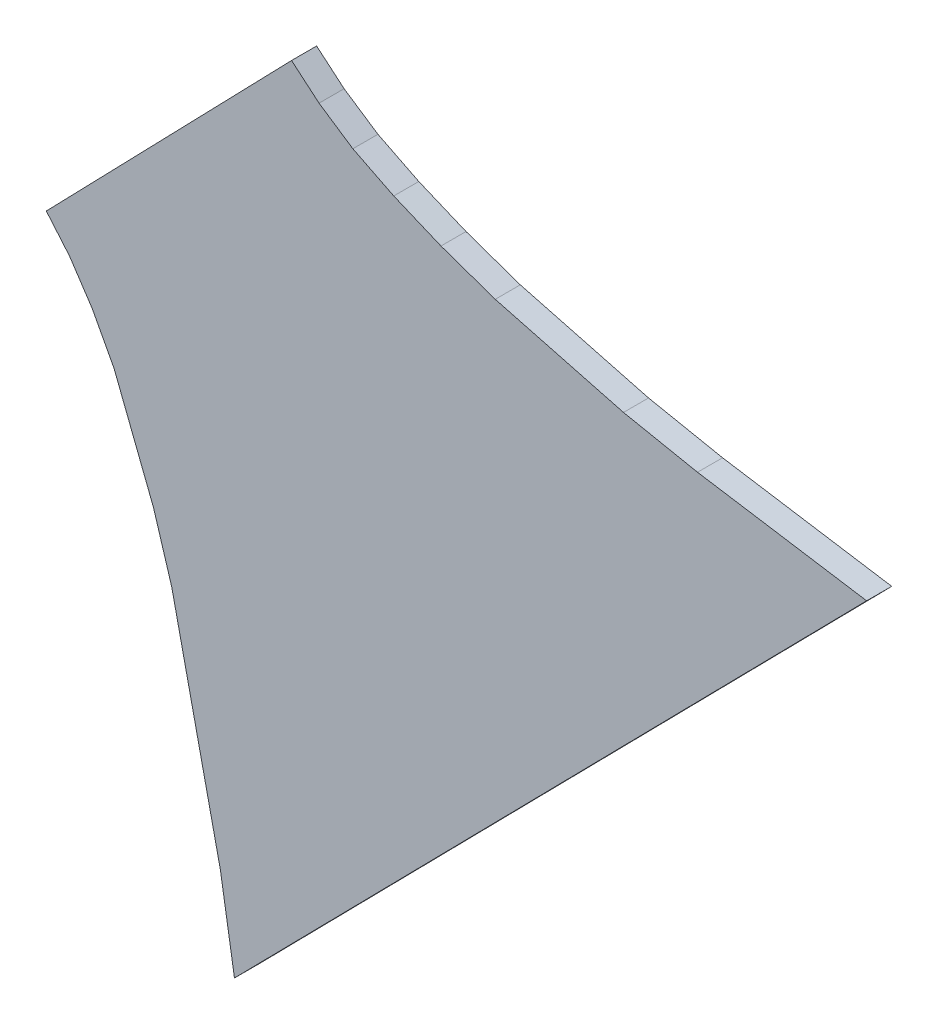
ISO-10303-21;
HEADER;
FILE_DESCRIPTION(('STEP AP214'),'2;1');
FILE_NAME('part.step','',(''),(''),'','','');
FILE_SCHEMA(('AUTOMOTIVE_DESIGN { 1 0 10303 214 1 1 1 1 }'));
ENDSEC;
DATA;
#1=APPLICATION_CONTEXT('core data for automotive mechanical design processes');
#2=APPLICATION_PROTOCOL_DEFINITION('international standard','automotive_design',2000,#1);
#3=PRODUCT_CONTEXT('',#1,'mechanical');
#4=PRODUCT('Part','Part','',(#3));
#5=PRODUCT_RELATED_PRODUCT_CATEGORY('part','',(#4));
#6=PRODUCT_DEFINITION_FORMATION('','',#4);
#7=PRODUCT_DEFINITION_CONTEXT('part definition',#1,'design');
#8=PRODUCT_DEFINITION('design','',#6,#7);
#9=PRODUCT_DEFINITION_SHAPE('','',#8);
#10=(LENGTH_UNIT() NAMED_UNIT(*) SI_UNIT(.MILLI.,.METRE.));
#11=(NAMED_UNIT(*) PLANE_ANGLE_UNIT() SI_UNIT($,.RADIAN.));
#12=(NAMED_UNIT(*) SI_UNIT($,.STERADIAN.) SOLID_ANGLE_UNIT());
#13=UNCERTAINTY_MEASURE_WITH_UNIT(LENGTH_MEASURE(1.E-05),#10,'distance_accuracy_value','');
#14=(GEOMETRIC_REPRESENTATION_CONTEXT(3) GLOBAL_UNCERTAINTY_ASSIGNED_CONTEXT((#13)) GLOBAL_UNIT_ASSIGNED_CONTEXT((#10,
#11,#12)) REPRESENTATION_CONTEXT('',''));
#15=CARTESIAN_POINT('',(0.,0.,0.));
#16=DIRECTION('',(0.,0.,1.));
#17=DIRECTION('',(1.,0.,0.));
#18=AXIS2_PLACEMENT_3D('',#15,#16,#17);
#19=CARTESIAN_POINT('',(96.3420028686523,104.190002441406,0.));
#20=DIRECTION('',(0.763425936268127,0.645895378395862,0.));
#21=DIRECTION('',(0.645895378395862,-0.763425936268127,0.));
#22=AXIS2_PLACEMENT_3D('',#19,#20,#21);
#23=PLANE('',#22);
#24=DIRECTION('',(0.645895378395862,-0.763425936268127,0.));
#25=VECTOR('',#24,1.);
#26=CARTESIAN_POINT('',(96.3420028686523,104.190002441406,0.03556));
#27=LINE('',#26,#25);
#28=CARTESIAN_POINT('',(96.3420028686523,104.190002441406,0.03556));
#29=VERTEX_POINT('',#28);
#30=CARTESIAN_POINT('',(96.375,104.151000976562,0.03556));
#31=VERTEX_POINT('',#30);
#32=EDGE_CURVE('E11',#29,#31,#27,.T.);
#33=ORIENTED_EDGE('',*,*,#32,.F.);
#34=DIRECTION('',(0.,0.,1.));
#35=VECTOR('',#34,1.);
#36=CARTESIAN_POINT('',(96.3420028686523,104.190002441406,0.));
#37=LINE('',#36,#35);
#38=CARTESIAN_POINT('',(96.3420028686523,104.190002441406,0.));
#39=VERTEX_POINT('',#38);
#40=EDGE_CURVE('E24',#39,#29,#37,.T.);
#41=ORIENTED_EDGE('',*,*,#40,.F.);
#42=DIRECTION('',(0.645895378395862,-0.763425936268127,0.));
#43=VECTOR('',#42,1.);
#44=CARTESIAN_POINT('',(96.3420028686523,104.190002441406,0.));
#45=LINE('',#44,#43);
#46=CARTESIAN_POINT('',(96.375,104.151000976562,0.));
#47=VERTEX_POINT('',#46);
#48=EDGE_CURVE('E154',#39,#47,#45,.T.);
#49=ORIENTED_EDGE('',*,*,#48,.T.);
#50=DIRECTION('',(0.,0.,1.));
#51=VECTOR('',#50,1.);
#52=CARTESIAN_POINT('',(96.375,104.151000976562,0.));
#53=LINE('',#52,#51);
#54=EDGE_CURVE('E37',#47,#31,#53,.T.);
#55=ORIENTED_EDGE('',*,*,#54,.T.);
#56=EDGE_LOOP('',(#33,#41,#49,#55));
#57=FACE_BOUND('',#56,.T.);
#58=ADVANCED_FACE('F17',(#57),#23,.F.);
#59=CARTESIAN_POINT('',(96.375,104.151000976562,0.));
#60=DIRECTION('',(0.832090983134532,0.554639158179629,0.));
#61=DIRECTION('',(0.554639158179629,-0.832090983134532,0.));
#62=AXIS2_PLACEMENT_3D('',#59,#60,#61);
#63=PLANE('',#62);
#64=DIRECTION('',(0.554639158179629,-0.832090983134532,0.));
#65=VECTOR('',#64,1.);
#66=CARTESIAN_POINT('',(96.375,104.151000976562,0.03556));
#67=LINE('',#66,#65);
#68=CARTESIAN_POINT('',(96.4069976806641,104.102996826172,0.03556));
#69=VERTEX_POINT('',#68);
#70=EDGE_CURVE('E266',#31,#69,#67,.T.);
#71=ORIENTED_EDGE('',*,*,#70,.F.);
#72=ORIENTED_EDGE('',*,*,#54,.F.);
#73=DIRECTION('',(0.554639158179629,-0.832090983134532,0.));
#74=VECTOR('',#73,1.);
#75=CARTESIAN_POINT('',(96.375,104.151000976562,0.));
#76=LINE('',#75,#74);
#77=CARTESIAN_POINT('',(96.4069976806641,104.102996826172,0.));
#78=VERTEX_POINT('',#77);
#79=EDGE_CURVE('E263',#47,#78,#76,.T.);
#80=ORIENTED_EDGE('',*,*,#79,.T.);
#81=DIRECTION('',(0.,0.,1.));
#82=VECTOR('',#81,1.);
#83=CARTESIAN_POINT('',(96.4069976806641,104.102996826172,0.));
#84=LINE('',#83,#82);
#85=EDGE_CURVE('E261',#78,#69,#84,.T.);
#86=ORIENTED_EDGE('',*,*,#85,.T.);
#87=EDGE_LOOP('',(#71,#72,#80,#86));
#88=FACE_BOUND('',#87,.T.);
#89=ADVANCED_FACE('F274',(#88),#63,.F.);
#90=CARTESIAN_POINT('',(96.4069976806641,104.102996826172,0.));
#91=DIRECTION('',(0.881890090249672,0.471455054824344,0.));
#92=DIRECTION('',(0.471455054824344,-0.881890090249672,0.));
#93=AXIS2_PLACEMENT_3D('',#90,#91,#92);
#94=PLANE('',#93);
#95=DIRECTION('',(0.471455054824344,-0.881890090249672,0.));
#96=VECTOR('',#95,1.);
#97=CARTESIAN_POINT('',(96.4069976806641,104.102996826172,0.03556));
#98=LINE('',#97,#96);
#99=CARTESIAN_POINT('',(96.438003540039,104.044998168945,0.03556));
#100=VERTEX_POINT('',#99);
#101=EDGE_CURVE('E258',#69,#100,#98,.T.);
#102=ORIENTED_EDGE('',*,*,#101,.F.);
#103=ORIENTED_EDGE('',*,*,#85,.F.);
#104=DIRECTION('',(0.471455054824344,-0.881890090249672,0.));
#105=VECTOR('',#104,1.);
#106=CARTESIAN_POINT('',(96.4069976806641,104.102996826172,0.));
#107=LINE('',#106,#105);
#108=CARTESIAN_POINT('',(96.438003540039,104.044998168945,0.));
#109=VERTEX_POINT('',#108);
#110=EDGE_CURVE('E255',#78,#109,#107,.T.);
#111=ORIENTED_EDGE('',*,*,#110,.T.);
#112=DIRECTION('',(0.,0.,1.));
#113=VECTOR('',#112,1.);
#114=CARTESIAN_POINT('',(96.438003540039,104.044998168945,0.));
#115=LINE('',#114,#113);
#116=EDGE_CURVE('E253',#109,#100,#115,.T.);
#117=ORIENTED_EDGE('',*,*,#116,.T.);
#118=EDGE_LOOP('',(#102,#103,#111,#117));
#119=FACE_BOUND('',#118,.T.);
#120=ADVANCED_FACE('F280',(#119),#94,.F.);
#121=CARTESIAN_POINT('',(96.438003540039,104.044998168945,0.));
#122=DIRECTION('',(0.931145260292367,0.36464846665667,0.));
#123=DIRECTION('',(0.36464846665667,-0.931145260292367,0.));
#124=AXIS2_PLACEMENT_3D('',#121,#122,#123);
#125=PLANE('',#124);
#126=DIRECTION('',(0.36464846665667,-0.931145260292367,0.));
#127=VECTOR('',#126,1.);
#128=CARTESIAN_POINT('',(96.438003540039,104.044998168945,0.03556));
#129=LINE('',#128,#127);
#130=CARTESIAN_POINT('',(96.4940032958984,103.902000427246,0.03556));
#131=VERTEX_POINT('',#130);
#132=EDGE_CURVE('E250',#100,#131,#129,.T.);
#133=ORIENTED_EDGE('',*,*,#132,.F.);
#134=ORIENTED_EDGE('',*,*,#116,.F.);
#135=DIRECTION('',(0.36464846665667,-0.931145260292367,0.));
#136=VECTOR('',#135,1.);
#137=CARTESIAN_POINT('',(96.438003540039,104.044998168945,0.));
#138=LINE('',#137,#136);
#139=CARTESIAN_POINT('',(96.4940032958984,103.902000427246,0.));
#140=VERTEX_POINT('',#139);
#141=EDGE_CURVE('E247',#109,#140,#138,.T.);
#142=ORIENTED_EDGE('',*,*,#141,.T.);
#143=DIRECTION('',(0.,0.,1.));
#144=VECTOR('',#143,1.);
#145=CARTESIAN_POINT('',(96.4940032958984,103.902000427246,0.));
#146=LINE('',#145,#144);
#147=EDGE_CURVE('E245',#140,#131,#146,.T.);
#148=ORIENTED_EDGE('',*,*,#147,.T.);
#149=EDGE_LOOP('',(#133,#134,#142,#148));
#150=FACE_BOUND('',#149,.T.);
#151=ADVANCED_FACE('F282',(#150),#125,.F.);
#152=CARTESIAN_POINT('',(96.4940032958984,103.902000427246,0.));
#153=DIRECTION('',(0.956284246933247,0.292438778323451,0.));
#154=DIRECTION('',(0.292438778323451,-0.956284246933247,0.));
#155=AXIS2_PLACEMENT_3D('',#152,#153,#154);
#156=PLANE('',#155);
#157=DIRECTION('',(0.292438778323451,-0.956284246933247,0.));
#158=VECTOR('',#157,1.);
#159=CARTESIAN_POINT('',(96.4940032958984,103.902000427246,0.03556));
#160=LINE('',#159,#158);
#161=CARTESIAN_POINT('',(96.5199966430664,103.817001342773,0.03556));
#162=VERTEX_POINT('',#161);
#163=EDGE_CURVE('E242',#131,#162,#160,.T.);
#164=ORIENTED_EDGE('',*,*,#163,.F.);
#165=ORIENTED_EDGE('',*,*,#147,.F.);
#166=DIRECTION('',(0.292438778323451,-0.956284246933247,0.));
#167=VECTOR('',#166,1.);
#168=CARTESIAN_POINT('',(96.4940032958984,103.902000427246,0.));
#169=LINE('',#168,#167);
#170=CARTESIAN_POINT('',(96.5199966430664,103.817001342773,0.));
#171=VERTEX_POINT('',#170);
#172=EDGE_CURVE('E239',#140,#171,#169,.T.);
#173=ORIENTED_EDGE('',*,*,#172,.T.);
#174=DIRECTION('',(0.,0.,1.));
#175=VECTOR('',#174,1.);
#176=CARTESIAN_POINT('',(96.5199966430664,103.817001342773,0.));
#177=LINE('',#176,#175);
#178=EDGE_CURVE('E237',#171,#162,#177,.T.);
#179=ORIENTED_EDGE('',*,*,#178,.T.);
#180=EDGE_LOOP('',(#164,#165,#173,#179));
#181=FACE_BOUND('',#180,.T.);
#182=ADVANCED_FACE('F287',(#181),#156,.F.);
#183=CARTESIAN_POINT('',(96.5199966430664,103.817001342773,0.));
#184=DIRECTION('',(0.976553070580183,0.21527679935473,0.));
#185=DIRECTION('',(0.21527679935473,-0.976553070580183,0.));
#186=AXIS2_PLACEMENT_3D('',#183,#184,#185);
#187=PLANE('',#186);
#188=DIRECTION('',(0.21527679935473,-0.976553070580183,0.));
#189=VECTOR('',#188,1.);
#190=CARTESIAN_POINT('',(96.5199966430664,103.817001342773,0.03556));
#191=LINE('',#190,#189);
#192=CARTESIAN_POINT('',(96.588996887207,103.503997802734,0.03556));
#193=VERTEX_POINT('',#192);
#194=EDGE_CURVE('E234',#162,#193,#191,.T.);
#195=ORIENTED_EDGE('',*,*,#194,.F.);
#196=ORIENTED_EDGE('',*,*,#178,.F.);
#197=DIRECTION('',(0.21527679935473,-0.976553070580183,0.));
#198=VECTOR('',#197,1.);
#199=CARTESIAN_POINT('',(96.5199966430664,103.817001342773,0.));
#200=LINE('',#199,#198);
#201=CARTESIAN_POINT('',(96.588996887207,103.503997802734,0.));
#202=VERTEX_POINT('',#201);
#203=EDGE_CURVE('E231',#171,#202,#200,.T.);
#204=ORIENTED_EDGE('',*,*,#203,.T.);
#205=DIRECTION('',(0.,0.,1.));
#206=VECTOR('',#205,1.);
#207=CARTESIAN_POINT('',(96.588996887207,103.503997802734,0.));
#208=LINE('',#207,#206);
#209=EDGE_CURVE('E229',#202,#193,#208,.T.);
#210=ORIENTED_EDGE('',*,*,#209,.T.);
#211=EDGE_LOOP('',(#195,#196,#204,#210));
#212=FACE_BOUND('',#211,.T.);
#213=ADVANCED_FACE('F290',(#212),#187,.F.);
#214=CARTESIAN_POINT('',(96.588996887207,103.503997802734,0.));
#215=DIRECTION('',(0.987031644404503,0.160525801490424,0.));
#216=DIRECTION('',(0.160525801490424,-0.987031644404503,0.));
#217=AXIS2_PLACEMENT_3D('',#214,#215,#216);
#218=PLANE('',#217);
#219=DIRECTION('',(0.160525801490424,-0.987031644404503,0.));
#220=VECTOR('',#219,1.);
#221=CARTESIAN_POINT('',(96.588996887207,103.503997802734,0.03556));
#222=LINE('',#221,#220);
#223=CARTESIAN_POINT('',(96.609001159668,103.380996704102,0.03556));
#224=VERTEX_POINT('',#223);
#225=EDGE_CURVE('E226',#193,#224,#222,.T.);
#226=ORIENTED_EDGE('',*,*,#225,.F.);
#227=ORIENTED_EDGE('',*,*,#209,.F.);
#228=DIRECTION('',(0.160525801490424,-0.987031644404503,0.));
#229=VECTOR('',#228,1.);
#230=CARTESIAN_POINT('',(96.588996887207,103.503997802734,0.));
#231=LINE('',#230,#229);
#232=CARTESIAN_POINT('',(96.609001159668,103.380996704102,0.));
#233=VERTEX_POINT('',#232);
#234=EDGE_CURVE('E223',#202,#233,#231,.T.);
#235=ORIENTED_EDGE('',*,*,#234,.T.);
#236=DIRECTION('',(0.,0.,1.));
#237=VECTOR('',#236,1.);
#238=CARTESIAN_POINT('',(96.609001159668,103.380996704102,0.));
#239=LINE('',#238,#237);
#240=EDGE_CURVE('E221',#233,#224,#239,.T.);
#241=ORIENTED_EDGE('',*,*,#240,.T.);
#242=EDGE_LOOP('',(#226,#227,#235,#241));
#243=FACE_BOUND('',#242,.T.);
#244=ADVANCED_FACE('F295',(#243),#218,.F.);
#245=CARTESIAN_POINT('',(96.609001159668,103.380996704102,0.));
#246=DIRECTION('',(-0.712948239240305,0.70121666278273,0.));
#247=DIRECTION('',(0.70121666278273,0.712948239240305,0.));
#248=AXIS2_PLACEMENT_3D('',#245,#246,#247);
#249=PLANE('',#248);
#250=DIRECTION('',(0.70121666278273,0.712948239240305,0.));
#251=VECTOR('',#250,1.);
#252=CARTESIAN_POINT('',(96.609001159668,103.380996704102,0.03556));
#253=LINE('',#252,#251);
#254=CARTESIAN_POINT('',(97.5059967041016,104.292999267578,0.03556));
#255=VERTEX_POINT('',#254);
#256=EDGE_CURVE('E218',#224,#255,#253,.T.);
#257=ORIENTED_EDGE('',*,*,#256,.F.);
#258=ORIENTED_EDGE('',*,*,#240,.F.);
#259=DIRECTION('',(0.70121666278273,0.712948239240305,0.));
#260=VECTOR('',#259,1.);
#261=CARTESIAN_POINT('',(96.609001159668,103.380996704102,0.));
#262=LINE('',#261,#260);
#263=CARTESIAN_POINT('',(97.5059967041016,104.292999267578,0.));
#264=VERTEX_POINT('',#263);
#265=EDGE_CURVE('E215',#233,#264,#262,.T.);
#266=ORIENTED_EDGE('',*,*,#265,.T.);
#267=DIRECTION('',(0.,0.,1.));
#268=VECTOR('',#267,1.);
#269=CARTESIAN_POINT('',(97.5059967041016,104.292999267578,0.));
#270=LINE('',#269,#268);
#271=EDGE_CURVE('E213',#264,#255,#270,.T.);
#272=ORIENTED_EDGE('',*,*,#271,.T.);
#273=EDGE_LOOP('',(#257,#258,#266,#272));
#274=FACE_BOUND('',#273,.T.);
#275=ADVANCED_FACE('F298',(#274),#249,.F.);
#276=CARTESIAN_POINT('',(97.5059967041016,104.292999267578,0.));
#277=DIRECTION('',(-0.156394666310873,-0.987694643272662,0.));
#278=DIRECTION('',(-0.987694643272662,0.156394666310873,0.));
#279=AXIS2_PLACEMENT_3D('',#276,#277,#278);
#280=PLANE('',#279);
#281=DIRECTION('',(-0.987694643272662,0.156394666310873,0.));
#282=VECTOR('',#281,1.);
#283=CARTESIAN_POINT('',(97.5059967041016,104.292999267578,0.03556));
#284=LINE('',#283,#282);
#285=CARTESIAN_POINT('',(97.265998840332,104.331001281738,0.03556));
#286=VERTEX_POINT('',#285);
#287=EDGE_CURVE('E210',#255,#286,#284,.T.);
#288=ORIENTED_EDGE('',*,*,#287,.F.);
#289=ORIENTED_EDGE('',*,*,#271,.F.);
#290=DIRECTION('',(-0.987694643272662,0.156394666310873,0.));
#291=VECTOR('',#290,1.);
#292=CARTESIAN_POINT('',(97.5059967041016,104.292999267578,0.));
#293=LINE('',#292,#291);
#294=CARTESIAN_POINT('',(97.265998840332,104.331001281738,0.));
#295=VERTEX_POINT('',#294);
#296=EDGE_CURVE('E207',#264,#295,#293,.T.);
#297=ORIENTED_EDGE('',*,*,#296,.T.);
#298=DIRECTION('',(0.,0.,1.));
#299=VECTOR('',#298,1.);
#300=CARTESIAN_POINT('',(97.265998840332,104.331001281738,0.));
#301=LINE('',#300,#299);
#302=EDGE_CURVE('E205',#295,#286,#301,.T.);
#303=ORIENTED_EDGE('',*,*,#302,.T.);
#304=EDGE_LOOP('',(#288,#289,#297,#303));
#305=FACE_BOUND('',#304,.T.);
#306=ADVANCED_FACE('F303',(#305),#280,.F.);
#307=CARTESIAN_POINT('',(97.265998840332,104.331001281738,0.));
#308=DIRECTION('',(-0.196088729995348,-0.980586156321214,0.));
#309=DIRECTION('',(-0.980586156321214,0.196088729995348,0.));
#310=AXIS2_PLACEMENT_3D('',#307,#308,#309);
#311=PLANE('',#310);
#312=DIRECTION('',(-0.980586156321213,0.196088729995348,0.));
#313=VECTOR('',#312,1.);
#314=CARTESIAN_POINT('',(97.265998840332,104.331001281738,0.03556));
#315=LINE('',#314,#313);
#316=CARTESIAN_POINT('',(97.161003112793,104.351997375488,0.03556));
#317=VERTEX_POINT('',#316);
#318=EDGE_CURVE('E202',#286,#317,#315,.T.);
#319=ORIENTED_EDGE('',*,*,#318,.F.);
#320=ORIENTED_EDGE('',*,*,#302,.F.);
#321=DIRECTION('',(-0.980586156321213,0.196088729995348,0.));
#322=VECTOR('',#321,1.);
#323=CARTESIAN_POINT('',(97.265998840332,104.331001281738,0.));
#324=LINE('',#323,#322);
#325=CARTESIAN_POINT('',(97.161003112793,104.351997375488,0.));
#326=VERTEX_POINT('',#325);
#327=EDGE_CURVE('E199',#295,#326,#324,.T.);
#328=ORIENTED_EDGE('',*,*,#327,.T.);
#329=DIRECTION('',(0.,0.,1.));
#330=VECTOR('',#329,1.);
#331=CARTESIAN_POINT('',(97.161003112793,104.351997375488,0.));
#332=LINE('',#331,#330);
#333=EDGE_CURVE('E197',#326,#317,#332,.T.);
#334=ORIENTED_EDGE('',*,*,#333,.T.);
#335=EDGE_LOOP('',(#319,#320,#328,#334));
#336=FACE_BOUND('',#335,.T.);
#337=ADVANCED_FACE('F306',(#336),#311,.F.);
#338=CARTESIAN_POINT('',(97.161003112793,104.351997375488,0.));
#339=DIRECTION('',(-0.255027948031509,-0.966933682174139,0.));
#340=DIRECTION('',(-0.966933682174139,0.255027948031509,0.));
#341=AXIS2_PLACEMENT_3D('',#338,#339,#340);
#342=PLANE('',#341);
#343=DIRECTION('',(-0.966933682174139,0.255027948031509,0.));
#344=VECTOR('',#343,1.);
#345=CARTESIAN_POINT('',(97.161003112793,104.351997375488,0.03556));
#346=LINE('',#345,#344);
#347=CARTESIAN_POINT('',(96.9789962768555,104.400001525879,0.03556));
#348=VERTEX_POINT('',#347);
#349=EDGE_CURVE('E194',#317,#348,#346,.T.);
#350=ORIENTED_EDGE('',*,*,#349,.F.);
#351=ORIENTED_EDGE('',*,*,#333,.F.);
#352=DIRECTION('',(-0.966933682174139,0.255027948031509,0.));
#353=VECTOR('',#352,1.);
#354=CARTESIAN_POINT('',(97.161003112793,104.351997375488,0.));
#355=LINE('',#354,#353);
#356=CARTESIAN_POINT('',(96.9789962768555,104.400001525879,0.));
#357=VERTEX_POINT('',#356);
#358=EDGE_CURVE('E191',#326,#357,#355,.T.);
#359=ORIENTED_EDGE('',*,*,#358,.T.);
#360=DIRECTION('',(0.,0.,1.));
#361=VECTOR('',#360,1.);
#362=CARTESIAN_POINT('',(96.9789962768555,104.400001525879,0.));
#363=LINE('',#362,#361);
#364=EDGE_CURVE('E189',#357,#348,#363,.T.);
#365=ORIENTED_EDGE('',*,*,#364,.T.);
#366=EDGE_LOOP('',(#350,#351,#359,#365));
#367=FACE_BOUND('',#366,.T.);
#368=ADVANCED_FACE('F311',(#367),#342,.F.);
#369=CARTESIAN_POINT('',(96.9789962768555,104.400001525879,0.));
#370=DIRECTION('',(-0.33091681426385,-0.94365992923164,0.));
#371=DIRECTION('',(-0.94365992923164,0.33091681426385,0.));
#372=AXIS2_PLACEMENT_3D('',#369,#370,#371);
#373=PLANE('',#372);
#374=DIRECTION('',(-0.94365992923164,0.33091681426385,0.));
#375=VECTOR('',#374,1.);
#376=CARTESIAN_POINT('',(96.9789962768555,104.400001525879,0.03556));
#377=LINE('',#376,#375);
#378=CARTESIAN_POINT('',(96.9020004272461,104.427001953125,0.03556));
#379=VERTEX_POINT('',#378);
#380=EDGE_CURVE('E186',#348,#379,#377,.T.);
#381=ORIENTED_EDGE('',*,*,#380,.F.);
#382=ORIENTED_EDGE('',*,*,#364,.F.);
#383=DIRECTION('',(-0.94365992923164,0.33091681426385,0.));
#384=VECTOR('',#383,1.);
#385=CARTESIAN_POINT('',(96.9789962768555,104.400001525879,0.));
#386=LINE('',#385,#384);
#387=CARTESIAN_POINT('',(96.9020004272461,104.427001953125,0.));
#388=VERTEX_POINT('',#387);
#389=EDGE_CURVE('E183',#357,#388,#386,.T.);
#390=ORIENTED_EDGE('',*,*,#389,.T.);
#391=DIRECTION('',(0.,0.,1.));
#392=VECTOR('',#391,1.);
#393=CARTESIAN_POINT('',(96.9020004272461,104.427001953125,0.));
#394=LINE('',#393,#392);
#395=EDGE_CURVE('E181',#388,#379,#394,.T.);
#396=ORIENTED_EDGE('',*,*,#395,.T.);
#397=EDGE_LOOP('',(#381,#382,#390,#396));
#398=FACE_BOUND('',#397,.T.);
#399=ADVANCED_FACE('F314',(#398),#373,.F.);
#400=CARTESIAN_POINT('',(96.9020004272461,104.427001953125,0.));
#401=DIRECTION('',(-0.385584994163033,-0.922672321182495,0.));
#402=DIRECTION('',(-0.922672321182495,0.385584994163033,0.));
#403=AXIS2_PLACEMENT_3D('',#400,#401,#402);
#404=PLANE('',#403);
#405=DIRECTION('',(-0.922672321182495,0.385584994163033,0.));
#406=VECTOR('',#405,1.);
#407=CARTESIAN_POINT('',(96.9020004272461,104.427001953125,0.03556));
#408=LINE('',#407,#406);
#409=CARTESIAN_POINT('',(96.8349990844727,104.455001831055,0.03556));
#410=VERTEX_POINT('',#409);
#411=EDGE_CURVE('E178',#379,#410,#408,.T.);
#412=ORIENTED_EDGE('',*,*,#411,.F.);
#413=ORIENTED_EDGE('',*,*,#395,.F.);
#414=DIRECTION('',(-0.922672321182495,0.385584994163033,0.));
#415=VECTOR('',#414,1.);
#416=CARTESIAN_POINT('',(96.9020004272461,104.427001953125,0.));
#417=LINE('',#416,#415);
#418=CARTESIAN_POINT('',(96.8349990844727,104.455001831055,0.));
#419=VERTEX_POINT('',#418);
#420=EDGE_CURVE('E175',#388,#419,#417,.T.);
#421=ORIENTED_EDGE('',*,*,#420,.T.);
#422=DIRECTION('',(0.,0.,1.));
#423=VECTOR('',#422,1.);
#424=CARTESIAN_POINT('',(96.8349990844727,104.455001831055,0.));
#425=LINE('',#424,#423);
#426=EDGE_CURVE('E173',#419,#410,#425,.T.);
#427=ORIENTED_EDGE('',*,*,#426,.T.);
#428=EDGE_LOOP('',(#412,#413,#421,#427));
#429=FACE_BOUND('',#428,.T.);
#430=ADVANCED_FACE('F319',(#429),#404,.F.);
#431=CARTESIAN_POINT('',(96.8349990844727,104.455001831055,0.));
#432=DIRECTION('',(-0.447213595499958,-0.894427190999916,0.));
#433=DIRECTION('',(-0.894427190999916,0.447213595499958,0.));
#434=AXIS2_PLACEMENT_3D('',#431,#432,#433);
#435=PLANE('',#434);
#436=DIRECTION('',(-0.894427190999916,0.447213595499958,0.));
#437=VECTOR('',#436,1.);
#438=CARTESIAN_POINT('',(96.8349990844727,104.455001831055,0.03556));
#439=LINE('',#438,#437);
#440=CARTESIAN_POINT('',(96.7770004272461,104.484001159668,0.03556));
#441=VERTEX_POINT('',#440);
#442=EDGE_CURVE('E170',#410,#441,#439,.T.);
#443=ORIENTED_EDGE('',*,*,#442,.F.);
#444=ORIENTED_EDGE('',*,*,#426,.F.);
#445=DIRECTION('',(-0.894427190999916,0.447213595499958,0.));
#446=VECTOR('',#445,1.);
#447=CARTESIAN_POINT('',(96.8349990844727,104.455001831055,0.));
#448=LINE('',#447,#446);
#449=CARTESIAN_POINT('',(96.7770004272461,104.484001159668,0.));
#450=VERTEX_POINT('',#449);
#451=EDGE_CURVE('E167',#419,#450,#448,.T.);
#452=ORIENTED_EDGE('',*,*,#451,.T.);
#453=DIRECTION('',(0.,0.,1.));
#454=VECTOR('',#453,1.);
#455=CARTESIAN_POINT('',(96.7770004272461,104.484001159668,0.));
#456=LINE('',#455,#454);
#457=EDGE_CURVE('E165',#450,#441,#456,.T.);
#458=ORIENTED_EDGE('',*,*,#457,.T.);
#459=EDGE_LOOP('',(#443,#444,#452,#458));
#460=FACE_BOUND('',#459,.T.);
#461=ADVANCED_FACE('F322',(#460),#435,.F.);
#462=CARTESIAN_POINT('',(96.7770004272461,104.484001159668,0.));
#463=DIRECTION('',(-0.554639158179629,-0.832090983134532,0.));
#464=DIRECTION('',(-0.832090983134532,0.554639158179629,0.));
#465=AXIS2_PLACEMENT_3D('',#462,#463,#464);
#466=PLANE('',#465);
#467=DIRECTION('',(-0.832090983134532,0.554639158179629,0.));
#468=VECTOR('',#467,1.);
#469=CARTESIAN_POINT('',(96.7770004272461,104.484001159668,0.03556));
#470=LINE('',#469,#468);
#471=CARTESIAN_POINT('',(96.7289962768555,104.515998840332,0.03556));
#472=VERTEX_POINT('',#471);
#473=EDGE_CURVE('E162',#441,#472,#470,.T.);
#474=ORIENTED_EDGE('',*,*,#473,.F.);
#475=ORIENTED_EDGE('',*,*,#457,.F.);
#476=DIRECTION('',(-0.832090983134532,0.554639158179629,0.));
#477=VECTOR('',#476,1.);
#478=CARTESIAN_POINT('',(96.7770004272461,104.484001159668,0.));
#479=LINE('',#478,#477);
#480=CARTESIAN_POINT('',(96.7289962768555,104.515998840332,0.));
#481=VERTEX_POINT('',#480);
#482=EDGE_CURVE('E160',#450,#481,#479,.T.);
#483=ORIENTED_EDGE('',*,*,#482,.T.);
#484=DIRECTION('',(0.,0.,1.));
#485=VECTOR('',#484,1.);
#486=CARTESIAN_POINT('',(96.7289962768555,104.515998840332,0.));
#487=LINE('',#486,#485);
#488=EDGE_CURVE('E145',#481,#472,#487,.T.);
#489=ORIENTED_EDGE('',*,*,#488,.T.);
#490=EDGE_LOOP('',(#474,#475,#483,#489));
#491=FACE_BOUND('',#490,.T.);
#492=ADVANCED_FACE('F325',(#491),#466,.F.);
#493=CARTESIAN_POINT('',(96.7289962768555,104.515998840332,0.));
#494=DIRECTION('',(-0.646056043640666,-0.763289976663764,0.));
#495=DIRECTION('',(-0.763289976663764,0.646056043640666,0.));
#496=AXIS2_PLACEMENT_3D('',#493,#494,#495);
#497=PLANE('',#496);
#498=DIRECTION('',(-0.763289976663764,0.646056043640666,0.));
#499=VECTOR('',#498,1.);
#500=CARTESIAN_POINT('',(96.7289962768555,104.515998840332,0.03556));
#501=LINE('',#500,#499);
#502=CARTESIAN_POINT('',(96.6900024414062,104.549003601074,0.03556));
#503=VERTEX_POINT('',#502);
#504=EDGE_CURVE('E149',#472,#503,#501,.T.);
#505=ORIENTED_EDGE('',*,*,#504,.F.);
#506=ORIENTED_EDGE('',*,*,#488,.F.);
#507=DIRECTION('',(-0.763289976663764,0.646056043640666,0.));
#508=VECTOR('',#507,1.);
#509=CARTESIAN_POINT('',(96.7289962768555,104.515998840332,0.));
#510=LINE('',#509,#508);
#511=CARTESIAN_POINT('',(96.6900024414062,104.549003601074,0.));
#512=VERTEX_POINT('',#511);
#513=EDGE_CURVE('E141',#481,#512,#510,.T.);
#514=ORIENTED_EDGE('',*,*,#513,.T.);
#515=DIRECTION('',(0.,0.,1.));
#516=VECTOR('',#515,1.);
#517=CARTESIAN_POINT('',(96.6900024414062,104.549003601074,0.));
#518=LINE('',#517,#516);
#519=EDGE_CURVE('E131',#512,#503,#518,.T.);
#520=ORIENTED_EDGE('',*,*,#519,.T.);
#521=EDGE_LOOP('',(#505,#506,#514,#520));
#522=FACE_BOUND('',#521,.T.);
#523=ADVANCED_FACE('F144',(#522),#497,.F.);
#524=CARTESIAN_POINT('',(96.6900024414062,104.549003601074,0.));
#525=DIRECTION('',(0.718023091642574,-0.696019281247322,0.));
#526=DIRECTION('',(-0.696019281247322,-0.718023091642574,0.));
#527=AXIS2_PLACEMENT_3D('',#524,#525,#526);
#528=PLANE('',#527);
#529=DIRECTION('',(-0.696019281247322,-0.718023091642574,0.));
#530=VECTOR('',#529,1.);
#531=CARTESIAN_POINT('',(96.6900024414062,104.549003601074,0.03556));
#532=LINE('',#531,#530);
#533=EDGE_CURVE('E137',#503,#29,#532,.T.);
#534=ORIENTED_EDGE('',*,*,#533,.F.);
#535=ORIENTED_EDGE('',*,*,#519,.F.);
#536=DIRECTION('',(-0.696019281247322,-0.718023091642574,0.));
#537=VECTOR('',#536,1.);
#538=CARTESIAN_POINT('',(96.6900024414062,104.549003601074,0.));
#539=LINE('',#538,#537);
#540=EDGE_CURVE('E135',#512,#39,#539,.T.);
#541=ORIENTED_EDGE('',*,*,#540,.T.);
#542=ORIENTED_EDGE('',*,*,#40,.T.);
#543=EDGE_LOOP('',(#534,#535,#541,#542));
#544=FACE_BOUND('',#543,.T.);
#545=ADVANCED_FACE('F133',(#544),#528,.F.);
#546=CARTESIAN_POINT('',(96.3420028686523,104.190002441406,0.));
#547=DIRECTION('',(0.,0.,1.));
#548=DIRECTION('',(1.,0.,0.));
#549=AXIS2_PLACEMENT_3D('',#546,#547,#548);
#550=PLANE('',#549);
#551=ORIENTED_EDGE('',*,*,#540,.F.);
#552=ORIENTED_EDGE('',*,*,#513,.F.);
#553=ORIENTED_EDGE('',*,*,#482,.F.);
#554=ORIENTED_EDGE('',*,*,#451,.F.);
#555=ORIENTED_EDGE('',*,*,#420,.F.);
#556=ORIENTED_EDGE('',*,*,#389,.F.);
#557=ORIENTED_EDGE('',*,*,#358,.F.);
#558=ORIENTED_EDGE('',*,*,#327,.F.);
#559=ORIENTED_EDGE('',*,*,#296,.F.);
#560=ORIENTED_EDGE('',*,*,#265,.F.);
#561=ORIENTED_EDGE('',*,*,#234,.F.);
#562=ORIENTED_EDGE('',*,*,#203,.F.);
#563=ORIENTED_EDGE('',*,*,#172,.F.);
#564=ORIENTED_EDGE('',*,*,#141,.F.);
#565=ORIENTED_EDGE('',*,*,#110,.F.);
#566=ORIENTED_EDGE('',*,*,#79,.F.);
#567=ORIENTED_EDGE('',*,*,#48,.F.);
#568=EDGE_LOOP('',(#551,#552,#553,#554,#555,#556,#557,#558,#559,#560,#561,#562,#563,#564,#565,
#566,#567));
#569=FACE_BOUND('',#568,.T.);
#570=ADVANCED_FACE('F152',(#569),#550,.F.);
#571=CARTESIAN_POINT('',(96.3420028686523,104.190002441406,0.03556));
#572=DIRECTION('',(0.,0.,1.));
#573=DIRECTION('',(1.,0.,0.));
#574=AXIS2_PLACEMENT_3D('',#571,#572,#573);
#575=PLANE('',#574);
#576=ORIENTED_EDGE('',*,*,#32,.T.);
#577=ORIENTED_EDGE('',*,*,#70,.T.);
#578=ORIENTED_EDGE('',*,*,#101,.T.);
#579=ORIENTED_EDGE('',*,*,#132,.T.);
#580=ORIENTED_EDGE('',*,*,#163,.T.);
#581=ORIENTED_EDGE('',*,*,#194,.T.);
#582=ORIENTED_EDGE('',*,*,#225,.T.);
#583=ORIENTED_EDGE('',*,*,#256,.T.);
#584=ORIENTED_EDGE('',*,*,#287,.T.);
#585=ORIENTED_EDGE('',*,*,#318,.T.);
#586=ORIENTED_EDGE('',*,*,#349,.T.);
#587=ORIENTED_EDGE('',*,*,#380,.T.);
#588=ORIENTED_EDGE('',*,*,#411,.T.);
#589=ORIENTED_EDGE('',*,*,#442,.T.);
#590=ORIENTED_EDGE('',*,*,#473,.T.);
#591=ORIENTED_EDGE('',*,*,#504,.T.);
#592=ORIENTED_EDGE('',*,*,#533,.T.);
#593=EDGE_LOOP('',(#576,#577,#578,#579,#580,#581,#582,#583,#584,#585,#586,#587,#588,#589,#590,
#591,#592));
#594=FACE_BOUND('',#593,.T.);
#595=ADVANCED_FACE('F277',(#594),#575,.T.);
#596=CLOSED_SHELL('',(#58,#89,#120,#151,#182,#213,#244,#275,#306,#337,#368,#399,#430,#461,#492,
#523,#545,#570,#595));
#597=MANIFOLD_SOLID_BREP('B1',#596);
#598=ADVANCED_BREP_SHAPE_REPRESENTATION('',(#18,#597),#14);
#599=SHAPE_DEFINITION_REPRESENTATION(#9,#598);
ENDSEC;
END-ISO-10303-21;
